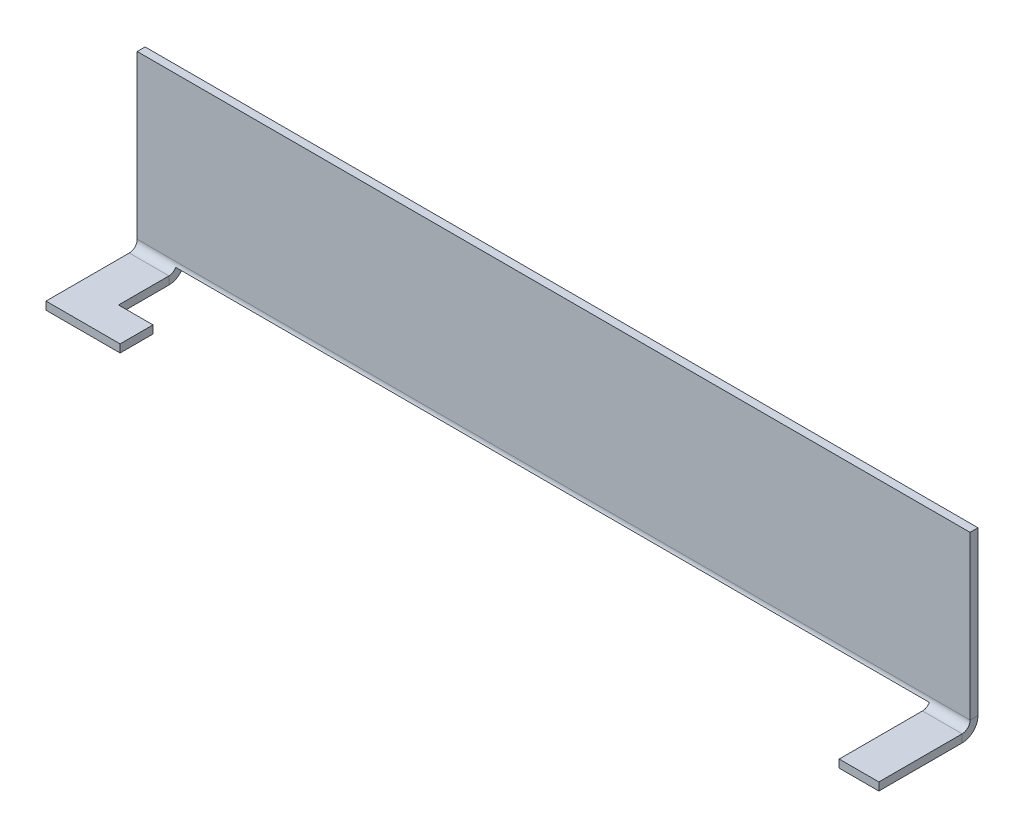
ISO-10303-21;
HEADER;
FILE_DESCRIPTION(('STEP AP214'),'2;1');
FILE_NAME('part.step','',(''),(''),'','','');
FILE_SCHEMA(('AUTOMOTIVE_DESIGN { 1 0 10303 214 1 1 1 1 }'));
ENDSEC;
DATA;
#1=APPLICATION_CONTEXT('core data for automotive mechanical design processes');
#2=APPLICATION_PROTOCOL_DEFINITION('international standard','automotive_design',2000,#1);
#3=PRODUCT_CONTEXT('',#1,'mechanical');
#4=PRODUCT('Part','Part','',(#3));
#5=PRODUCT_RELATED_PRODUCT_CATEGORY('part','',(#4));
#6=PRODUCT_DEFINITION_FORMATION('','',#4);
#7=PRODUCT_DEFINITION_CONTEXT('part definition',#1,'design');
#8=PRODUCT_DEFINITION('design','',#6,#7);
#9=PRODUCT_DEFINITION_SHAPE('','',#8);
#10=(LENGTH_UNIT() NAMED_UNIT(*) SI_UNIT(.MILLI.,.METRE.));
#11=(NAMED_UNIT(*) PLANE_ANGLE_UNIT() SI_UNIT($,.RADIAN.));
#12=(NAMED_UNIT(*) SI_UNIT($,.STERADIAN.) SOLID_ANGLE_UNIT());
#13=UNCERTAINTY_MEASURE_WITH_UNIT(LENGTH_MEASURE(1.E-05),#10,'distance_accuracy_value','');
#14=(GEOMETRIC_REPRESENTATION_CONTEXT(3) GLOBAL_UNCERTAINTY_ASSIGNED_CONTEXT((#13)) GLOBAL_UNIT_ASSIGNED_CONTEXT((#10,
#11,#12)) REPRESENTATION_CONTEXT('',''));
#15=CARTESIAN_POINT('',(0.,0.,0.));
#16=DIRECTION('',(0.,0.,1.));
#17=DIRECTION('',(1.,0.,0.));
#18=AXIS2_PLACEMENT_3D('',#15,#16,#17);
#19=CARTESIAN_POINT('',(105.,-18.5,2.00000000000001));
#20=DIRECTION('',(1.,0.,0.));
#21=DIRECTION('',(0.,-1.,0.));
#22=AXIS2_PLACEMENT_3D('',#19,#20,#21);
#23=CYLINDRICAL_SURFACE('',#22,4.00000000000002);
#24=DIRECTION('',(-1.,0.,0.));
#25=VECTOR('',#24,1.);
#26=CARTESIAN_POINT('',(95.,-20.5,-1.46410161513776));
#27=LINE('',#26,#25);
#28=CARTESIAN_POINT('',(95.,-20.5,-1.46410161513778));
#29=VERTEX_POINT('',#28);
#30=CARTESIAN_POINT('',(-95.,-20.5,-1.46410161513778));
#31=VERTEX_POINT('',#30);
#32=EDGE_CURVE('E567',#29,#31,#27,.T.);
#33=ORIENTED_EDGE('',*,*,#32,.T.);
#34=CARTESIAN_POINT('',(-95.,-18.5,1.99999999999999));
#35=DIRECTION('',(-1.,0.,0.));
#36=DIRECTION('',(0.,0.,1.));
#37=AXIS2_PLACEMENT_3D('',#34,#35,#36);
#38=CIRCLE('',#37,4.);
#39=CARTESIAN_POINT('',(-95.,-22.5,1.99999999999999));
#40=VERTEX_POINT('',#39);
#41=EDGE_CURVE('E191',#31,#40,#38,.T.);
#42=ORIENTED_EDGE('',*,*,#41,.T.);
#43=DIRECTION('',(1.,0.,0.));
#44=VECTOR('',#43,1.);
#45=CARTESIAN_POINT('',(0.,-22.5,1.99999999999999));
#46=LINE('',#45,#44);
#47=CARTESIAN_POINT('',(-105.,-22.5,1.99999999999999));
#48=VERTEX_POINT('',#47);
#49=EDGE_CURVE('E208',#48,#40,#46,.T.);
#50=ORIENTED_EDGE('',*,*,#49,.F.);
#51=CARTESIAN_POINT('',(-105.,-18.5,2.00000000000001));
#52=DIRECTION('',(1.,0.,0.));
#53=DIRECTION('',(0.,0.,-1.));
#54=AXIS2_PLACEMENT_3D('',#51,#52,#53);
#55=CIRCLE('',#54,4.00000000000002);
#56=CARTESIAN_POINT('',(-105.,-18.5,-2.));
#57=VERTEX_POINT('',#56);
#58=EDGE_CURVE('E80',#57,#48,#55,.F.);
#59=ORIENTED_EDGE('',*,*,#58,.F.);
#60=DIRECTION('',(1.,0.,0.));
#61=VECTOR('',#60,1.);
#62=CARTESIAN_POINT('',(105.,-18.5,-2.00000000000001));
#63=LINE('',#62,#61);
#64=CARTESIAN_POINT('',(105.,-18.5,-2.00000000000001));
#65=VERTEX_POINT('',#64);
#66=EDGE_CURVE('E223',#65,#57,#63,.F.);
#67=ORIENTED_EDGE('',*,*,#66,.F.);
#68=CARTESIAN_POINT('',(105.,-18.5,2.00000000000001));
#69=DIRECTION('',(1.,0.,0.));
#70=DIRECTION('',(0.,0.,-1.));
#71=AXIS2_PLACEMENT_3D('',#68,#69,#70);
#72=CIRCLE('',#71,4.00000000000002);
#73=CARTESIAN_POINT('',(105.,-22.5,2.));
#74=VERTEX_POINT('',#73);
#75=EDGE_CURVE('E226',#74,#65,#72,.T.);
#76=ORIENTED_EDGE('',*,*,#75,.F.);
#77=CARTESIAN_POINT('',(95.,-22.5,2.));
#78=VERTEX_POINT('',#77);
#79=EDGE_CURVE('E211',#78,#74,#46,.T.);
#80=ORIENTED_EDGE('',*,*,#79,.F.);
#81=CARTESIAN_POINT('',(95.,-18.5,1.99999999999999));
#82=DIRECTION('',(1.,0.,0.));
#83=DIRECTION('',(0.,0.,-1.));
#84=AXIS2_PLACEMENT_3D('',#81,#82,#83);
#85=CIRCLE('',#84,4.);
#86=EDGE_CURVE('E540',#78,#29,#85,.T.);
#87=ORIENTED_EDGE('',*,*,#86,.T.);
#88=EDGE_LOOP('',(#33,#42,#50,#59,#67,#76,#80,#87));
#89=FACE_BOUND('',#88,.T.);
#90=ADVANCED_FACE('F57',(#89),#23,.T.);
#91=CARTESIAN_POINT('',(105.,-18.5,2.00000000000001));
#92=DIRECTION('',(1.,0.,0.));
#93=DIRECTION('',(0.,-1.,0.));
#94=AXIS2_PLACEMENT_3D('',#91,#92,#93);
#95=CYLINDRICAL_SURFACE('',#94,2.00000000000002);
#96=CARTESIAN_POINT('',(-95.,-18.5,1.99999999999999));
#97=DIRECTION('',(-1.,0.,0.));
#98=DIRECTION('',(0.,0.,1.));
#99=AXIS2_PLACEMENT_3D('',#96,#97,#98);
#100=CIRCLE('',#99,2.);
#101=CARTESIAN_POINT('',(-95.,-19.5,0.267949192431097));
#102=VERTEX_POINT('',#101);
#103=CARTESIAN_POINT('',(-95.,-20.5,2.));
#104=VERTEX_POINT('',#103);
#105=EDGE_CURVE('E576',#102,#104,#100,.T.);
#106=ORIENTED_EDGE('',*,*,#105,.F.);
#107=DIRECTION('',(-1.,0.,0.));
#108=VECTOR('',#107,1.);
#109=CARTESIAN_POINT('',(210.062387423124,-19.5,0.267949192431117));
#110=LINE('',#109,#108);
#111=CARTESIAN_POINT('',(95.,-19.5,0.267949192431101));
#112=VERTEX_POINT('',#111);
#113=EDGE_CURVE('E546',#112,#102,#110,.T.);
#114=ORIENTED_EDGE('',*,*,#113,.F.);
#115=CARTESIAN_POINT('',(95.,-18.5,1.99999999999999));
#116=DIRECTION('',(-1.,0.,0.));
#117=DIRECTION('',(0.,0.,1.));
#118=AXIS2_PLACEMENT_3D('',#115,#116,#117);
#119=CIRCLE('',#118,2.);
#120=CARTESIAN_POINT('',(95.,-20.5,2.00000000000001));
#121=VERTEX_POINT('',#120);
#122=EDGE_CURVE('E537',#121,#112,#119,.F.);
#123=ORIENTED_EDGE('',*,*,#122,.F.);
#124=DIRECTION('',(-1.,0.,0.));
#125=VECTOR('',#124,1.);
#126=CARTESIAN_POINT('',(-105.,-20.5,1.99999999999999));
#127=LINE('',#126,#125);
#128=CARTESIAN_POINT('',(105.,-20.5,2.));
#129=VERTEX_POINT('',#128);
#130=EDGE_CURVE('E218',#121,#129,#127,.F.);
#131=ORIENTED_EDGE('',*,*,#130,.T.);
#132=CARTESIAN_POINT('',(105.,-18.5,2.00000000000001));
#133=DIRECTION('',(1.,0.,0.));
#134=DIRECTION('',(0.,0.,-1.));
#135=AXIS2_PLACEMENT_3D('',#132,#133,#134);
#136=CIRCLE('',#135,2.00000000000002);
#137=CARTESIAN_POINT('',(105.,-18.5,0.));
#138=VERTEX_POINT('',#137);
#139=EDGE_CURVE('E236',#129,#138,#136,.T.);
#140=ORIENTED_EDGE('',*,*,#139,.T.);
#141=DIRECTION('',(1.,0.,0.));
#142=VECTOR('',#141,1.);
#143=CARTESIAN_POINT('',(105.,-18.5,0.));
#144=LINE('',#143,#142);
#145=CARTESIAN_POINT('',(-105.,-18.5,0.));
#146=VERTEX_POINT('',#145);
#147=EDGE_CURVE('E234',#138,#146,#144,.F.);
#148=ORIENTED_EDGE('',*,*,#147,.T.);
#149=CARTESIAN_POINT('',(-105.,-18.5,2.00000000000001));
#150=DIRECTION('',(1.,0.,0.));
#151=DIRECTION('',(0.,0.,-1.));
#152=AXIS2_PLACEMENT_3D('',#149,#150,#151);
#153=CIRCLE('',#152,2.00000000000002);
#154=CARTESIAN_POINT('',(-105.,-20.5,2.));
#155=VERTEX_POINT('',#154);
#156=EDGE_CURVE('E231',#146,#155,#153,.F.);
#157=ORIENTED_EDGE('',*,*,#156,.T.);
#158=EDGE_CURVE('E215',#155,#104,#127,.F.);
#159=ORIENTED_EDGE('',*,*,#158,.T.);
#160=EDGE_LOOP('',(#106,#114,#123,#131,#140,#148,#157,#159));
#161=FACE_BOUND('',#160,.T.);
#162=ADVANCED_FACE('F300',(#161),#95,.F.);
#163=CARTESIAN_POINT('',(0.,-22.5,0.));
#164=DIRECTION('',(0.,-1.,0.));
#165=DIRECTION('',(0.,0.,-1.));
#166=AXIS2_PLACEMENT_3D('',#163,#164,#165);
#167=PLANE('',#166);
#168=ORIENTED_EDGE('',*,*,#49,.T.);
#169=DIRECTION('',(0.,0.,-1.));
#170=VECTOR('',#169,1.);
#171=CARTESIAN_POINT('',(-95.,-22.5,0.));
#172=LINE('',#171,#170);
#173=CARTESIAN_POINT('',(-95.,-22.5000000000001,14.7071964096519));
#174=VERTEX_POINT('',#173);
#175=EDGE_CURVE('E590',#174,#40,#172,.T.);
#176=ORIENTED_EDGE('',*,*,#175,.F.);
#177=DIRECTION('',(-1.,0.,0.));
#178=VECTOR('',#177,1.);
#179=CARTESIAN_POINT('',(0.,-22.5,14.7071964096519));
#180=LINE('',#179,#178);
#181=CARTESIAN_POINT('',(-86.312353882546,-22.5000000000001,14.7071964096519));
#182=VERTEX_POINT('',#181);
#183=EDGE_CURVE('E180',#182,#174,#180,.T.);
#184=ORIENTED_EDGE('',*,*,#183,.F.);
#185=DIRECTION('',(0.,0.,-1.));
#186=VECTOR('',#185,1.);
#187=CARTESIAN_POINT('',(-86.312353882546,-22.5,0.));
#188=LINE('',#187,#186);
#189=CARTESIAN_POINT('',(-86.312353882546,-22.5000000000001,23.));
#190=VERTEX_POINT('',#189);
#191=EDGE_CURVE('E190',#190,#182,#188,.T.);
#192=ORIENTED_EDGE('',*,*,#191,.F.);
#193=DIRECTION('',(1.,0.,0.));
#194=VECTOR('',#193,1.);
#195=CARTESIAN_POINT('',(105.,-22.5000000000001,23.));
#196=LINE('',#195,#194);
#197=CARTESIAN_POINT('',(-105.,-22.5000000000001,23.));
#198=VERTEX_POINT('',#197);
#199=EDGE_CURVE('E189',#198,#190,#196,.T.);
#200=ORIENTED_EDGE('',*,*,#199,.F.);
#201=DIRECTION('',(0.,0.,1.));
#202=VECTOR('',#201,1.);
#203=CARTESIAN_POINT('',(-105.,-22.5000000000001,23.));
#204=LINE('',#203,#202);
#205=EDGE_CURVE('E203',#48,#198,#204,.T.);
#206=ORIENTED_EDGE('',*,*,#205,.F.);
#207=EDGE_LOOP('',(#168,#176,#184,#192,#200,#206));
#208=FACE_BOUND('',#207,.T.);
#209=ADVANCED_FACE('F305',(#208),#167,.T.);
#210=CARTESIAN_POINT('',(95.,-22.5000000000001,23.));
#211=VERTEX_POINT('',#210);
#212=CARTESIAN_POINT('',(105.,-22.5000000000001,23.));
#213=VERTEX_POINT('',#212);
#214=EDGE_CURVE('E560',#211,#213,#196,.T.);
#215=ORIENTED_EDGE('',*,*,#214,.F.);
#216=DIRECTION('',(0.,0.,1.));
#217=VECTOR('',#216,1.);
#218=CARTESIAN_POINT('',(95.,-22.5,0.));
#219=LINE('',#218,#217);
#220=EDGE_CURVE('E72',#78,#211,#219,.T.);
#221=ORIENTED_EDGE('',*,*,#220,.F.);
#222=ORIENTED_EDGE('',*,*,#79,.T.);
#223=DIRECTION('',(0.,0.,-1.));
#224=VECTOR('',#223,1.);
#225=CARTESIAN_POINT('',(105.,-22.5,0.));
#226=LINE('',#225,#224);
#227=EDGE_CURVE('E555',#213,#74,#226,.T.);
#228=ORIENTED_EDGE('',*,*,#227,.F.);
#229=EDGE_LOOP('',(#215,#221,#222,#228));
#230=FACE_BOUND('',#229,.T.);
#231=ADVANCED_FACE('F419',(#230),#167,.T.);
#232=CARTESIAN_POINT('',(0.,-20.5,0.));
#233=DIRECTION('',(0.,-1.,0.));
#234=DIRECTION('',(0.,0.,-1.));
#235=AXIS2_PLACEMENT_3D('',#232,#233,#234);
#236=PLANE('',#235);
#237=DIRECTION('',(0.,0.,-1.));
#238=VECTOR('',#237,1.);
#239=CARTESIAN_POINT('',(-95.,-20.5,0.));
#240=LINE('',#239,#238);
#241=CARTESIAN_POINT('',(-95.,-20.5000000000001,14.7071964096519));
#242=VERTEX_POINT('',#241);
#243=EDGE_CURVE('E222',#242,#104,#240,.T.);
#244=ORIENTED_EDGE('',*,*,#243,.T.);
#245=ORIENTED_EDGE('',*,*,#158,.F.);
#246=DIRECTION('',(0.,0.,-1.));
#247=VECTOR('',#246,1.);
#248=CARTESIAN_POINT('',(-105.,-20.5,0.));
#249=LINE('',#248,#247);
#250=CARTESIAN_POINT('',(-105.,-20.5000000000001,23.));
#251=VERTEX_POINT('',#250);
#252=EDGE_CURVE('E197',#155,#251,#249,.F.);
#253=ORIENTED_EDGE('',*,*,#252,.T.);
#254=DIRECTION('',(-1.,0.,0.));
#255=VECTOR('',#254,1.);
#256=CARTESIAN_POINT('',(0.,-20.5000000000001,23.));
#257=LINE('',#256,#255);
#258=CARTESIAN_POINT('',(-86.312353882546,-20.5000000000001,23.));
#259=VERTEX_POINT('',#258);
#260=EDGE_CURVE('E187',#251,#259,#257,.F.);
#261=ORIENTED_EDGE('',*,*,#260,.T.);
#262=DIRECTION('',(0.,0.,-1.));
#263=VECTOR('',#262,1.);
#264=CARTESIAN_POINT('',(-86.312353882546,-20.5,0.));
#265=LINE('',#264,#263);
#266=CARTESIAN_POINT('',(-86.312353882546,-20.5000000000001,14.7071964096519));
#267=VERTEX_POINT('',#266);
#268=EDGE_CURVE('E170',#259,#267,#265,.T.);
#269=ORIENTED_EDGE('',*,*,#268,.T.);
#270=DIRECTION('',(1.,0.,0.));
#271=VECTOR('',#270,1.);
#272=CARTESIAN_POINT('',(0.,-20.5,14.7071964096519));
#273=LINE('',#272,#271);
#274=EDGE_CURVE('E588',#267,#242,#273,.F.);
#275=ORIENTED_EDGE('',*,*,#274,.T.);
#276=EDGE_LOOP('',(#244,#245,#253,#261,#269,#275));
#277=FACE_BOUND('',#276,.T.);
#278=ADVANCED_FACE('F194',(#277),#236,.F.);
#279=DIRECTION('',(0.,0.,-1.));
#280=VECTOR('',#279,1.);
#281=CARTESIAN_POINT('',(95.,-20.5,0.));
#282=LINE('',#281,#280);
#283=CARTESIAN_POINT('',(95.,-20.5000000000001,23.));
#284=VERTEX_POINT('',#283);
#285=EDGE_CURVE('E541',#121,#284,#282,.F.);
#286=ORIENTED_EDGE('',*,*,#285,.T.);
#287=CARTESIAN_POINT('',(105.,-20.5000000000001,23.));
#288=VERTEX_POINT('',#287);
#289=EDGE_CURVE('E200',#284,#288,#257,.F.);
#290=ORIENTED_EDGE('',*,*,#289,.T.);
#291=DIRECTION('',(0.,0.,1.));
#292=VECTOR('',#291,1.);
#293=CARTESIAN_POINT('',(105.,-20.5,0.));
#294=LINE('',#293,#292);
#295=EDGE_CURVE('E199',#288,#129,#294,.F.);
#296=ORIENTED_EDGE('',*,*,#295,.T.);
#297=ORIENTED_EDGE('',*,*,#130,.F.);
#298=EDGE_LOOP('',(#286,#290,#296,#297));
#299=FACE_BOUND('',#298,.T.);
#300=ADVANCED_FACE('F402',(#299),#236,.F.);
#301=CARTESIAN_POINT('',(105.,-22.5000000000001,23.));
#302=DIRECTION('',(0.,0.,1.));
#303=DIRECTION('',(0.,-1.,0.));
#304=AXIS2_PLACEMENT_3D('',#301,#302,#303);
#305=PLANE('',#304);
#306=ORIENTED_EDGE('',*,*,#199,.T.);
#307=DIRECTION('',(0.,-1.,0.));
#308=VECTOR('',#307,1.);
#309=CARTESIAN_POINT('',(-86.312353882546,-22.5000000000001,23.));
#310=LINE('',#309,#308);
#311=EDGE_CURVE('E173',#190,#259,#310,.F.);
#312=ORIENTED_EDGE('',*,*,#311,.T.);
#313=ORIENTED_EDGE('',*,*,#260,.F.);
#314=DIRECTION('',(0.,1.,0.));
#315=VECTOR('',#314,1.);
#316=CARTESIAN_POINT('',(-105.,-22.5000000000001,23.));
#317=LINE('',#316,#315);
#318=EDGE_CURVE('E557',#198,#251,#317,.T.);
#319=ORIENTED_EDGE('',*,*,#318,.F.);
#320=EDGE_LOOP('',(#306,#312,#313,#319));
#321=FACE_BOUND('',#320,.T.);
#322=ADVANCED_FACE('F185',(#321),#305,.T.);
#323=ORIENTED_EDGE('',*,*,#289,.F.);
#324=DIRECTION('',(0.,-1.,0.));
#325=VECTOR('',#324,1.);
#326=CARTESIAN_POINT('',(95.,-22.5000000000001,23.));
#327=LINE('',#326,#325);
#328=EDGE_CURVE('E564',#211,#284,#327,.F.);
#329=ORIENTED_EDGE('',*,*,#328,.F.);
#330=ORIENTED_EDGE('',*,*,#214,.T.);
#331=DIRECTION('',(0.,1.,0.));
#332=VECTOR('',#331,1.);
#333=CARTESIAN_POINT('',(105.,-22.5000000000001,23.));
#334=LINE('',#333,#332);
#335=EDGE_CURVE('E239',#213,#288,#334,.T.);
#336=ORIENTED_EDGE('',*,*,#335,.T.);
#337=EDGE_LOOP('',(#323,#329,#330,#336));
#338=FACE_BOUND('',#337,.T.);
#339=ADVANCED_FACE('F290',(#338),#305,.T.);
#340=CARTESIAN_POINT('',(105.,22.5,-2.));
#341=DIRECTION('',(1.,0.,0.));
#342=DIRECTION('',(0.,0.,-1.));
#343=AXIS2_PLACEMENT_3D('',#340,#341,#342);
#344=PLANE('',#343);
#345=DIRECTION('',(0.,1.,0.));
#346=VECTOR('',#345,1.);
#347=CARTESIAN_POINT('',(105.,22.5,0.));
#348=LINE('',#347,#346);
#349=CARTESIAN_POINT('',(105.,22.5,0.));
#350=VERTEX_POINT('',#349);
#351=EDGE_CURVE('E256',#138,#350,#348,.T.);
#352=ORIENTED_EDGE('',*,*,#351,.F.);
#353=DIRECTION('',(0.,0.,-1.));
#354=VECTOR('',#353,1.);
#355=CARTESIAN_POINT('',(105.,-18.5,0.));
#356=LINE('',#355,#354);
#357=EDGE_CURVE('E228',#138,#65,#356,.T.);
#358=ORIENTED_EDGE('',*,*,#357,.T.);
#359=DIRECTION('',(0.,1.,0.));
#360=VECTOR('',#359,1.);
#361=CARTESIAN_POINT('',(105.,22.5,-2.));
#362=LINE('',#361,#360);
#363=CARTESIAN_POINT('',(105.,22.5,-2.));
#364=VERTEX_POINT('',#363);
#365=EDGE_CURVE('E248',#65,#364,#362,.T.);
#366=ORIENTED_EDGE('',*,*,#365,.T.);
#367=DIRECTION('',(0.,0.,1.));
#368=VECTOR('',#367,1.);
#369=CARTESIAN_POINT('',(105.,22.5,-2.));
#370=LINE('',#369,#368);
#371=EDGE_CURVE('E61',#364,#350,#370,.T.);
#372=ORIENTED_EDGE('',*,*,#371,.T.);
#373=EDGE_LOOP('',(#352,#358,#366,#372));
#374=FACE_BOUND('',#373,.T.);
#375=ADVANCED_FACE('F288',(#374),#344,.T.);
#376=CARTESIAN_POINT('',(0.,0.,-2.));
#377=DIRECTION('',(0.,0.,-1.));
#378=DIRECTION('',(-1.,0.,0.));
#379=AXIS2_PLACEMENT_3D('',#376,#377,#378);
#380=PLANE('',#379);
#381=ORIENTED_EDGE('',*,*,#365,.F.);
#382=ORIENTED_EDGE('',*,*,#66,.T.);
#383=DIRECTION('',(0.,-1.,0.));
#384=VECTOR('',#383,1.);
#385=CARTESIAN_POINT('',(-105.,22.5,-2.));
#386=LINE('',#385,#384);
#387=CARTESIAN_POINT('',(-105.,22.5,-2.));
#388=VERTEX_POINT('',#387);
#389=EDGE_CURVE('E245',#388,#57,#386,.T.);
#390=ORIENTED_EDGE('',*,*,#389,.F.);
#391=DIRECTION('',(-1.,0.,0.));
#392=VECTOR('',#391,1.);
#393=CARTESIAN_POINT('',(105.,22.5,-2.));
#394=LINE('',#393,#392);
#395=EDGE_CURVE('E251',#364,#388,#394,.T.);
#396=ORIENTED_EDGE('',*,*,#395,.F.);
#397=EDGE_LOOP('',(#381,#382,#390,#396));
#398=FACE_BOUND('',#397,.T.);
#399=ADVANCED_FACE('F278',(#398),#380,.T.);
#400=CARTESIAN_POINT('',(0.,0.,0.));
#401=DIRECTION('',(0.,0.,-1.));
#402=DIRECTION('',(-1.,0.,0.));
#403=AXIS2_PLACEMENT_3D('',#400,#401,#402);
#404=PLANE('',#403);
#405=ORIENTED_EDGE('',*,*,#147,.F.);
#406=ORIENTED_EDGE('',*,*,#351,.T.);
#407=DIRECTION('',(-1.,0.,0.));
#408=VECTOR('',#407,1.);
#409=CARTESIAN_POINT('',(105.,22.5,0.));
#410=LINE('',#409,#408);
#411=CARTESIAN_POINT('',(-105.,22.5,0.));
#412=VERTEX_POINT('',#411);
#413=EDGE_CURVE('E249',#350,#412,#410,.T.);
#414=ORIENTED_EDGE('',*,*,#413,.T.);
#415=DIRECTION('',(0.,-1.,0.));
#416=VECTOR('',#415,1.);
#417=CARTESIAN_POINT('',(-105.,22.5,0.));
#418=LINE('',#417,#416);
#419=EDGE_CURVE('E242',#412,#146,#418,.T.);
#420=ORIENTED_EDGE('',*,*,#419,.T.);
#421=EDGE_LOOP('',(#405,#406,#414,#420));
#422=FACE_BOUND('',#421,.T.);
#423=ADVANCED_FACE('F262',(#422),#404,.F.);
#424=CARTESIAN_POINT('',(-105.,22.5,-2.));
#425=DIRECTION('',(-1.,0.,0.));
#426=DIRECTION('',(0.,0.,1.));
#427=AXIS2_PLACEMENT_3D('',#424,#425,#426);
#428=PLANE('',#427);
#429=DIRECTION('',(0.,0.,-1.));
#430=VECTOR('',#429,1.);
#431=CARTESIAN_POINT('',(-105.,-18.5,0.));
#432=LINE('',#431,#430);
#433=EDGE_CURVE('E240',#146,#57,#432,.T.);
#434=ORIENTED_EDGE('',*,*,#433,.F.);
#435=ORIENTED_EDGE('',*,*,#419,.F.);
#436=DIRECTION('',(0.,0.,1.));
#437=VECTOR('',#436,1.);
#438=CARTESIAN_POINT('',(-105.,22.5,-2.));
#439=LINE('',#438,#437);
#440=EDGE_CURVE('E13',#388,#412,#439,.T.);
#441=ORIENTED_EDGE('',*,*,#440,.F.);
#442=ORIENTED_EDGE('',*,*,#389,.T.);
#443=EDGE_LOOP('',(#434,#435,#441,#442));
#444=FACE_BOUND('',#443,.T.);
#445=ADVANCED_FACE('F59',(#444),#428,.T.);
#446=CARTESIAN_POINT('',(105.,22.5,-2.));
#447=DIRECTION('',(0.,1.,0.));
#448=DIRECTION('',(-1.,0.,0.));
#449=AXIS2_PLACEMENT_3D('',#446,#447,#448);
#450=PLANE('',#449);
#451=ORIENTED_EDGE('',*,*,#413,.F.);
#452=ORIENTED_EDGE('',*,*,#371,.F.);
#453=ORIENTED_EDGE('',*,*,#395,.T.);
#454=ORIENTED_EDGE('',*,*,#440,.T.);
#455=EDGE_LOOP('',(#451,#452,#453,#454));
#456=FACE_BOUND('',#455,.T.);
#457=ADVANCED_FACE('F269',(#456),#450,.T.);
#458=CARTESIAN_POINT('',(-105.,-18.5,2.00000000000001));
#459=DIRECTION('',(-1.,0.,0.));
#460=DIRECTION('',(0.,0.,1.));
#461=AXIS2_PLACEMENT_3D('',#458,#459,#460);
#462=PLANE('',#461);
#463=DIRECTION('',(0.,-1.,0.));
#464=VECTOR('',#463,1.);
#465=CARTESIAN_POINT('',(-105.,-22.5,1.99999999999999));
#466=LINE('',#465,#464);
#467=EDGE_CURVE('E219',#155,#48,#466,.T.);
#468=ORIENTED_EDGE('',*,*,#467,.F.);
#469=ORIENTED_EDGE('',*,*,#156,.F.);
#470=ORIENTED_EDGE('',*,*,#433,.T.);
#471=ORIENTED_EDGE('',*,*,#58,.T.);
#472=EDGE_LOOP('',(#468,#469,#470,#471));
#473=FACE_BOUND('',#472,.T.);
#474=ADVANCED_FACE('F275',(#473),#462,.T.);
#475=CARTESIAN_POINT('',(105.,-18.5,2.00000000000001));
#476=DIRECTION('',(-1.,0.,0.));
#477=DIRECTION('',(0.,0.,1.));
#478=AXIS2_PLACEMENT_3D('',#475,#476,#477);
#479=PLANE('',#478);
#480=ORIENTED_EDGE('',*,*,#139,.F.);
#481=DIRECTION('',(0.,-1.,0.));
#482=VECTOR('',#481,1.);
#483=CARTESIAN_POINT('',(105.,-20.5,2.00000000000001));
#484=LINE('',#483,#482);
#485=EDGE_CURVE('E212',#129,#74,#484,.T.);
#486=ORIENTED_EDGE('',*,*,#485,.T.);
#487=ORIENTED_EDGE('',*,*,#75,.T.);
#488=ORIENTED_EDGE('',*,*,#357,.F.);
#489=EDGE_LOOP('',(#480,#486,#487,#488));
#490=FACE_BOUND('',#489,.T.);
#491=ADVANCED_FACE('F284',(#490),#479,.F.);
#492=CARTESIAN_POINT('',(105.,-22.5,0.));
#493=DIRECTION('',(1.,0.,0.));
#494=DIRECTION('',(0.,1.,0.));
#495=AXIS2_PLACEMENT_3D('',#492,#493,#494);
#496=PLANE('',#495);
#497=ORIENTED_EDGE('',*,*,#227,.T.);
#498=ORIENTED_EDGE('',*,*,#485,.F.);
#499=ORIENTED_EDGE('',*,*,#295,.F.);
#500=ORIENTED_EDGE('',*,*,#335,.F.);
#501=EDGE_LOOP('',(#497,#498,#499,#500));
#502=FACE_BOUND('',#501,.T.);
#503=ADVANCED_FACE('F314',(#502),#496,.T.);
#504=CARTESIAN_POINT('',(-105.,-22.5000000000001,23.));
#505=DIRECTION('',(-1.,0.,0.));
#506=DIRECTION('',(0.,-1.,0.));
#507=AXIS2_PLACEMENT_3D('',#504,#505,#506);
#508=PLANE('',#507);
#509=ORIENTED_EDGE('',*,*,#252,.F.);
#510=ORIENTED_EDGE('',*,*,#467,.T.);
#511=ORIENTED_EDGE('',*,*,#205,.T.);
#512=ORIENTED_EDGE('',*,*,#318,.T.);
#513=EDGE_LOOP('',(#509,#510,#511,#512));
#514=FACE_BOUND('',#513,.T.);
#515=ADVANCED_FACE('F309',(#514),#508,.T.);
#516=CARTESIAN_POINT('',(-95.,-22.5,0.));
#517=DIRECTION('',(-1.,0.,0.));
#518=DIRECTION('',(0.,0.,-1.));
#519=AXIS2_PLACEMENT_3D('',#516,#517,#518);
#520=PLANE('',#519);
#521=DIRECTION('',(0.,-1.,0.));
#522=VECTOR('',#521,1.);
#523=CARTESIAN_POINT('',(-95.,-22.5,14.7071964096519));
#524=LINE('',#523,#522);
#525=EDGE_CURVE('E585',#174,#242,#524,.F.);
#526=ORIENTED_EDGE('',*,*,#525,.F.);
#527=ORIENTED_EDGE('',*,*,#175,.T.);
#528=DIRECTION('',(0.,1.,0.));
#529=VECTOR('',#528,1.);
#530=CARTESIAN_POINT('',(-95.,-22.5,1.99999999999999));
#531=LINE('',#530,#529);
#532=EDGE_CURVE('E578',#40,#104,#531,.T.);
#533=ORIENTED_EDGE('',*,*,#532,.T.);
#534=ORIENTED_EDGE('',*,*,#243,.F.);
#535=EDGE_LOOP('',(#526,#527,#533,#534));
#536=FACE_BOUND('',#535,.T.);
#537=ADVANCED_FACE('F387',(#536),#520,.F.);
#538=CARTESIAN_POINT('',(0.,-22.5,14.7071964096519));
#539=DIRECTION('',(0.,0.,1.));
#540=DIRECTION('',(-1.,0.,0.));
#541=AXIS2_PLACEMENT_3D('',#538,#539,#540);
#542=PLANE('',#541);
#543=DIRECTION('',(0.,-1.,0.));
#544=VECTOR('',#543,1.);
#545=CARTESIAN_POINT('',(-86.312353882546,-22.5,14.7071964096519));
#546=LINE('',#545,#544);
#547=EDGE_CURVE('E176',#182,#267,#546,.F.);
#548=ORIENTED_EDGE('',*,*,#547,.F.);
#549=ORIENTED_EDGE('',*,*,#183,.T.);
#550=ORIENTED_EDGE('',*,*,#525,.T.);
#551=ORIENTED_EDGE('',*,*,#274,.F.);
#552=EDGE_LOOP('',(#548,#549,#550,#551));
#553=FACE_BOUND('',#552,.T.);
#554=ADVANCED_FACE('F456',(#553),#542,.F.);
#555=CARTESIAN_POINT('',(-86.312353882546,-22.5,0.));
#556=DIRECTION('',(-1.,0.,0.));
#557=DIRECTION('',(0.,0.,-1.));
#558=AXIS2_PLACEMENT_3D('',#555,#556,#557);
#559=PLANE('',#558);
#560=ORIENTED_EDGE('',*,*,#311,.F.);
#561=ORIENTED_EDGE('',*,*,#191,.T.);
#562=ORIENTED_EDGE('',*,*,#547,.T.);
#563=ORIENTED_EDGE('',*,*,#268,.F.);
#564=EDGE_LOOP('',(#560,#561,#562,#563));
#565=FACE_BOUND('',#564,.T.);
#566=ADVANCED_FACE('F172',(#565),#559,.F.);
#567=CARTESIAN_POINT('',(-95.,-18.5,1.99999999999999));
#568=DIRECTION('',(1.,0.,0.));
#569=DIRECTION('',(0.,0.,-1.));
#570=AXIS2_PLACEMENT_3D('',#567,#568,#569);
#571=PLANE('',#570);
#572=DIRECTION('',(0.,-0.500000000000003,-0.866025403784437));
#573=VECTOR('',#572,1.);
#574=CARTESIAN_POINT('',(-95.,-20.5,-1.46410161513775));
#575=LINE('',#574,#573);
#576=EDGE_CURVE('E569',#102,#31,#575,.T.);
#577=ORIENTED_EDGE('',*,*,#576,.F.);
#578=ORIENTED_EDGE('',*,*,#105,.T.);
#579=ORIENTED_EDGE('',*,*,#532,.F.);
#580=ORIENTED_EDGE('',*,*,#41,.F.);
#581=EDGE_LOOP('',(#577,#578,#579,#580));
#582=FACE_BOUND('',#581,.T.);
#583=ADVANCED_FACE('F477',(#582),#571,.T.);
#584=CARTESIAN_POINT('',(0.,-20.5,-1.46410161513776));
#585=DIRECTION('',(0.,-0.866025403784438,0.500000000000001));
#586=DIRECTION('',(-1.,0.,0.));
#587=AXIS2_PLACEMENT_3D('',#584,#585,#586);
#588=PLANE('',#587);
#589=DIRECTION('',(0.,-0.499999999999999,-0.866025403784439));
#590=VECTOR('',#589,1.);
#591=CARTESIAN_POINT('',(95.,-20.5,-1.46410161513776));
#592=LINE('',#591,#590);
#593=EDGE_CURVE('E547',#112,#29,#592,.T.);
#594=ORIENTED_EDGE('',*,*,#593,.F.);
#595=ORIENTED_EDGE('',*,*,#113,.T.);
#596=ORIENTED_EDGE('',*,*,#576,.T.);
#597=ORIENTED_EDGE('',*,*,#32,.F.);
#598=EDGE_LOOP('',(#594,#595,#596,#597));
#599=FACE_BOUND('',#598,.T.);
#600=ADVANCED_FACE('F487',(#599),#588,.T.);
#601=CARTESIAN_POINT('',(95.,-18.5,1.99999999999999));
#602=DIRECTION('',(-1.,0.,0.));
#603=DIRECTION('',(0.,0.,1.));
#604=AXIS2_PLACEMENT_3D('',#601,#602,#603);
#605=PLANE('',#604);
#606=DIRECTION('',(0.,1.,0.));
#607=VECTOR('',#606,1.);
#608=CARTESIAN_POINT('',(95.,-22.5,1.99999999999999));
#609=LINE('',#608,#607);
#610=EDGE_CURVE('E534',#78,#121,#609,.T.);
#611=ORIENTED_EDGE('',*,*,#610,.T.);
#612=ORIENTED_EDGE('',*,*,#122,.T.);
#613=ORIENTED_EDGE('',*,*,#593,.T.);
#614=ORIENTED_EDGE('',*,*,#86,.F.);
#615=EDGE_LOOP('',(#611,#612,#613,#614));
#616=FACE_BOUND('',#615,.T.);
#617=ADVANCED_FACE('F498',(#616),#605,.T.);
#618=CARTESIAN_POINT('',(95.,-22.5,0.));
#619=DIRECTION('',(1.,0.,0.));
#620=DIRECTION('',(0.,0.,1.));
#621=AXIS2_PLACEMENT_3D('',#618,#619,#620);
#622=PLANE('',#621);
#623=ORIENTED_EDGE('',*,*,#220,.T.);
#624=ORIENTED_EDGE('',*,*,#328,.T.);
#625=ORIENTED_EDGE('',*,*,#285,.F.);
#626=ORIENTED_EDGE('',*,*,#610,.F.);
#627=EDGE_LOOP('',(#623,#624,#625,#626));
#628=FACE_BOUND('',#627,.T.);
#629=ADVANCED_FACE('F509',(#628),#622,.F.);
#630=CLOSED_SHELL('',(#90,#162,#209,#231,#278,#300,#322,#339,#375,#399,#423,#445,#457,#474,#491,
#503,#515,#537,#554,#566,#583,#600,#617,#629));
#631=MANIFOLD_SOLID_BREP('B2',#630);
#632=ADVANCED_BREP_SHAPE_REPRESENTATION('',(#18,#631),#14);
#633=SHAPE_DEFINITION_REPRESENTATION(#9,#632);
ENDSEC;
END-ISO-10303-21;
